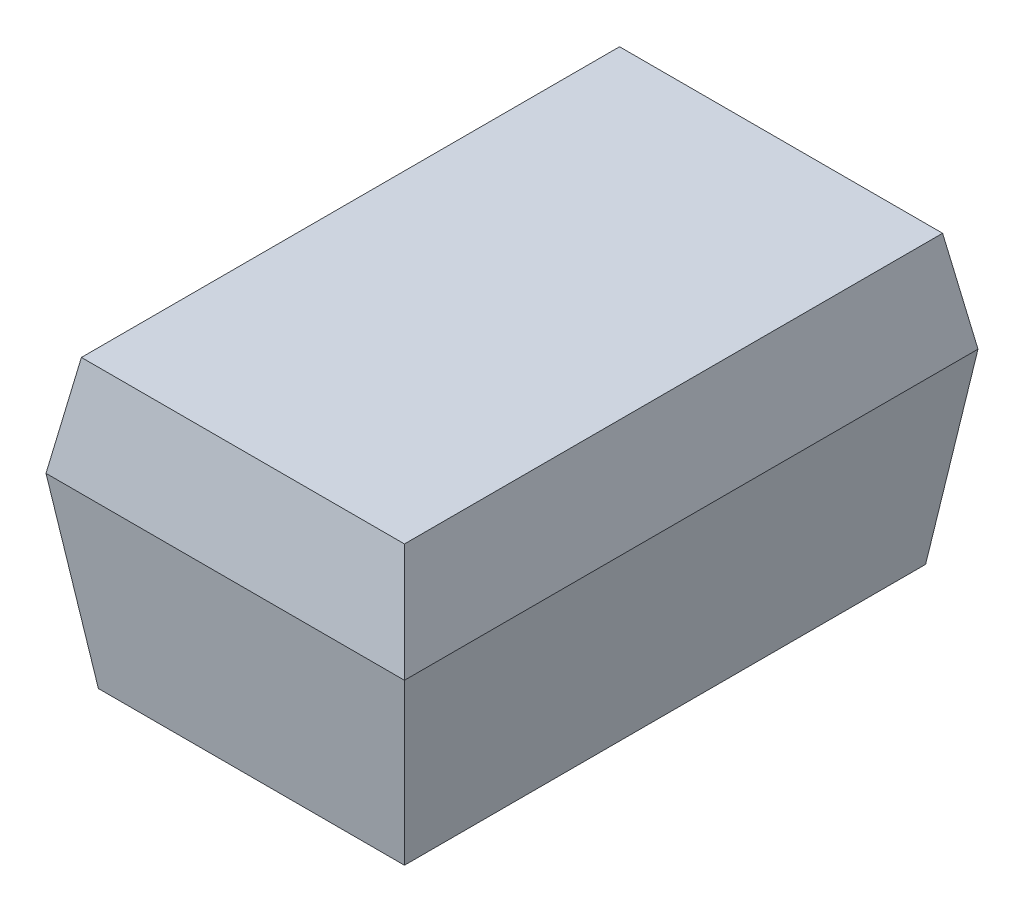
ISO-10303-21;
HEADER;
FILE_DESCRIPTION(('STEP AP214'),'2;1');
FILE_NAME('part.step','',(''),(''),'','','');
FILE_SCHEMA(('AUTOMOTIVE_DESIGN { 1 0 10303 214 1 1 1 1 }'));
ENDSEC;
DATA;
#1=APPLICATION_CONTEXT('core data for automotive mechanical design processes');
#2=APPLICATION_PROTOCOL_DEFINITION('international standard','automotive_design',2000,#1);
#3=PRODUCT_CONTEXT('',#1,'mechanical');
#4=PRODUCT('Part','Part','',(#3));
#5=PRODUCT_RELATED_PRODUCT_CATEGORY('part','',(#4));
#6=PRODUCT_DEFINITION_FORMATION('','',#4);
#7=PRODUCT_DEFINITION_CONTEXT('part definition',#1,'design');
#8=PRODUCT_DEFINITION('design','',#6,#7);
#9=PRODUCT_DEFINITION_SHAPE('','',#8);
#10=(LENGTH_UNIT() NAMED_UNIT(*) SI_UNIT(.MILLI.,.METRE.));
#11=(NAMED_UNIT(*) PLANE_ANGLE_UNIT() SI_UNIT($,.RADIAN.));
#12=(NAMED_UNIT(*) SI_UNIT($,.STERADIAN.) SOLID_ANGLE_UNIT());
#13=UNCERTAINTY_MEASURE_WITH_UNIT(LENGTH_MEASURE(1.E-05),#10,'distance_accuracy_value','');
#14=(GEOMETRIC_REPRESENTATION_CONTEXT(3) GLOBAL_UNCERTAINTY_ASSIGNED_CONTEXT((#13)) GLOBAL_UNIT_ASSIGNED_CONTEXT((#10,
#11,#12)) REPRESENTATION_CONTEXT('',''));
#15=CARTESIAN_POINT('',(0.,0.,0.));
#16=DIRECTION('',(0.,0.,1.));
#17=DIRECTION('',(1.,0.,0.));
#18=AXIS2_PLACEMENT_3D('',#15,#16,#17);
#19=CARTESIAN_POINT('',(-0.625,0.,1.));
#20=DIRECTION('',(-0.990268068741588,-0.139173100959942,0.));
#21=DIRECTION('',(0.139173100959942,-0.990268068741588,0.));
#22=AXIS2_PLACEMENT_3D('',#19,#20,#21);
#23=PLANE('',#22);
#24=DIRECTION('',(0.,0.,1.));
#25=VECTOR('',#24,1.);
#26=CARTESIAN_POINT('',(-0.625,0.,1.));
#27=LINE('',#26,#25);
#28=CARTESIAN_POINT('',(-0.625,0.,-1.));
#29=VERTEX_POINT('',#28);
#30=CARTESIAN_POINT('',(-0.625,0.,1.));
#31=VERTEX_POINT('',#30);
#32=EDGE_CURVE('E89',#29,#31,#27,.T.);
#33=ORIENTED_EDGE('',*,*,#32,.F.);
#34=DIRECTION('',(-0.137844537491984,0.980814848463889,-0.137844537491984));
#35=VECTOR('',#34,1.);
#36=CARTESIAN_POINT('',(-0.601248604355,-0.168999961439,-0.976248604355));
#37=LINE('',#36,#35);
#38=CARTESIAN_POINT('',(-0.533648457443,-0.65,-0.908648457443));
#39=VERTEX_POINT('',#38);
#40=EDGE_CURVE('E124',#39,#29,#37,.T.);
#41=ORIENTED_EDGE('',*,*,#40,.F.);
#42=DIRECTION('',(0.,0.,1.));
#43=VECTOR('',#42,1.);
#44=CARTESIAN_POINT('',(-0.533648457443,-0.65,0.));
#45=LINE('',#44,#43);
#46=CARTESIAN_POINT('',(-0.533648457443,-0.65,0.908648457443));
#47=VERTEX_POINT('',#46);
#48=EDGE_CURVE('E11',#39,#47,#45,.T.);
#49=ORIENTED_EDGE('',*,*,#48,.T.);
#50=DIRECTION('',(-0.137844537491984,0.980814848463889,0.137844537491984));
#51=VECTOR('',#50,1.);
#52=CARTESIAN_POINT('',(-0.625,0.,1.));
#53=LINE('',#52,#51);
#54=EDGE_CURVE('E27',#47,#31,#53,.T.);
#55=ORIENTED_EDGE('',*,*,#54,.T.);
#56=EDGE_LOOP('',(#33,#41,#49,#55));
#57=FACE_BOUND('',#56,.T.);
#58=ADVANCED_FACE('F17',(#57),#23,.T.);
#59=CARTESIAN_POINT('',(0.625,0.,-1.));
#60=DIRECTION('',(0.,-0.139173100959942,-0.990268068741588));
#61=DIRECTION('',(0.,0.990268068741588,-0.139173100959942));
#62=AXIS2_PLACEMENT_3D('',#59,#60,#61);
#63=PLANE('',#62);
#64=DIRECTION('',(-1.,0.,0.));
#65=VECTOR('',#64,1.);
#66=CARTESIAN_POINT('',(0.625,0.,-1.));
#67=LINE('',#66,#65);
#68=CARTESIAN_POINT('',(0.625,0.,-1.));
#69=VERTEX_POINT('',#68);
#70=EDGE_CURVE('E36',#69,#29,#67,.T.);
#71=ORIENTED_EDGE('',*,*,#70,.F.);
#72=DIRECTION('',(0.137844537491984,0.980814848463889,-0.137844537491984));
#73=VECTOR('',#72,1.);
#74=CARTESIAN_POINT('',(0.586997766967,-0.270399938303,-0.961997766967));
#75=LINE('',#74,#73);
#76=CARTESIAN_POINT('',(0.533648457443,-0.65,-0.908648457443));
#77=VERTEX_POINT('',#76);
#78=EDGE_CURVE('E118',#77,#69,#75,.T.);
#79=ORIENTED_EDGE('',*,*,#78,.F.);
#80=DIRECTION('',(-1.,0.,0.));
#81=VECTOR('',#80,1.);
#82=CARTESIAN_POINT('',(0.,-0.65,-0.908648457443));
#83=LINE('',#82,#81);
#84=EDGE_CURVE('E126',#77,#39,#83,.T.);
#85=ORIENTED_EDGE('',*,*,#84,.T.);
#86=ORIENTED_EDGE('',*,*,#40,.T.);
#87=EDGE_LOOP('',(#71,#79,#85,#86));
#88=FACE_BOUND('',#87,.T.);
#89=ADVANCED_FACE('F149',(#88),#63,.T.);
#90=CARTESIAN_POINT('',(0.625,0.,1.));
#91=DIRECTION('',(0.990268068741588,-0.139173100959942,0.));
#92=DIRECTION('',(0.139173100959942,0.990268068741588,0.));
#93=AXIS2_PLACEMENT_3D('',#90,#91,#92);
#94=PLANE('',#93);
#95=DIRECTION('',(0.,0.,-1.));
#96=VECTOR('',#95,1.);
#97=CARTESIAN_POINT('',(0.625,0.,1.));
#98=LINE('',#97,#96);
#99=CARTESIAN_POINT('',(0.625,0.,1.));
#100=VERTEX_POINT('',#99);
#101=EDGE_CURVE('E80',#100,#69,#98,.T.);
#102=ORIENTED_EDGE('',*,*,#101,.F.);
#103=DIRECTION('',(0.137844537491984,0.980814848463889,0.137844537491984));
#104=VECTOR('',#103,1.);
#105=CARTESIAN_POINT('',(0.625,0.,1.));
#106=LINE('',#105,#104);
#107=CARTESIAN_POINT('',(0.533648457443,-0.65,0.908648457443));
#108=VERTEX_POINT('',#107);
#109=EDGE_CURVE('E92',#108,#100,#106,.T.);
#110=ORIENTED_EDGE('',*,*,#109,.F.);
#111=DIRECTION('',(0.,0.,-1.));
#112=VECTOR('',#111,1.);
#113=CARTESIAN_POINT('',(0.533648457443,-0.65,0.));
#114=LINE('',#113,#112);
#115=EDGE_CURVE('E123',#108,#77,#114,.T.);
#116=ORIENTED_EDGE('',*,*,#115,.T.);
#117=ORIENTED_EDGE('',*,*,#78,.T.);
#118=EDGE_LOOP('',(#102,#110,#116,#117));
#119=FACE_BOUND('',#118,.T.);
#120=ADVANCED_FACE('F146',(#119),#94,.T.);
#121=CARTESIAN_POINT('',(0.625,0.,1.));
#122=DIRECTION('',(0.,-0.139173100959942,0.990268068741588));
#123=DIRECTION('',(0.,-0.990268068741588,-0.139173100959942));
#124=AXIS2_PLACEMENT_3D('',#121,#122,#123);
#125=PLANE('',#124);
#126=DIRECTION('',(1.,0.,0.));
#127=VECTOR('',#126,1.);
#128=CARTESIAN_POINT('',(0.625,0.,1.));
#129=LINE('',#128,#127);
#130=EDGE_CURVE('E90',#31,#100,#129,.T.);
#131=ORIENTED_EDGE('',*,*,#130,.F.);
#132=ORIENTED_EDGE('',*,*,#54,.F.);
#133=DIRECTION('',(1.,0.,0.));
#134=VECTOR('',#133,1.);
#135=CARTESIAN_POINT('',(0.,-0.65,0.908648457443));
#136=LINE('',#135,#134);
#137=EDGE_CURVE('E113',#47,#108,#136,.T.);
#138=ORIENTED_EDGE('',*,*,#137,.T.);
#139=ORIENTED_EDGE('',*,*,#109,.T.);
#140=EDGE_LOOP('',(#131,#132,#138,#139));
#141=FACE_BOUND('',#140,.T.);
#142=ADVANCED_FACE('F111',(#141),#125,.T.);
#143=CARTESIAN_POINT('',(0.,-0.65,0.));
#144=DIRECTION('',(0.,1.,0.));
#145=DIRECTION('',(0.,0.,1.));
#146=AXIS2_PLACEMENT_3D('',#143,#144,#145);
#147=PLANE('',#146);
#148=ORIENTED_EDGE('',*,*,#48,.F.);
#149=ORIENTED_EDGE('',*,*,#84,.F.);
#150=ORIENTED_EDGE('',*,*,#115,.F.);
#151=ORIENTED_EDGE('',*,*,#137,.F.);
#152=EDGE_LOOP('',(#148,#149,#150,#151));
#153=FACE_BOUND('',#152,.T.);
#154=ADVANCED_FACE('F137',(#153),#147,.F.);
#155=CARTESIAN_POINT('',(-0.625,0.,1.));
#156=DIRECTION('',(-0.98480775301219,0.173648177667033,0.));
#157=DIRECTION('',(-0.173648177667033,-0.98480775301219,0.));
#158=AXIS2_PLACEMENT_3D('',#155,#156,#157);
#159=PLANE('',#158);
#160=ORIENTED_EDGE('',*,*,#32,.T.);
#161=DIRECTION('',(-0.171087869745971,-0.970287525247837,0.171087869745971));
#162=VECTOR('',#161,1.);
#163=CARTESIAN_POINT('',(-0.588411176032,0.20750553217,0.963411176032));
#164=LINE('',#163,#162);
#165=CARTESIAN_POINT('',(-0.563285556752,0.35,0.938285556752));
#166=VERTEX_POINT('',#165);
#167=EDGE_CURVE('E95',#166,#31,#164,.T.);
#168=ORIENTED_EDGE('',*,*,#167,.F.);
#169=DIRECTION('',(0.,0.,1.));
#170=VECTOR('',#169,1.);
#171=CARTESIAN_POINT('',(-0.563285556752,0.35,1.));
#172=LINE('',#171,#170);
#173=CARTESIAN_POINT('',(-0.563285556752,0.35,-0.938285556752));
#174=VERTEX_POINT('',#173);
#175=EDGE_CURVE('E82',#174,#166,#172,.T.);
#176=ORIENTED_EDGE('',*,*,#175,.F.);
#177=DIRECTION('',(-0.171087869745971,-0.970287525247837,-0.171087869745971));
#178=VECTOR('',#177,1.);
#179=CARTESIAN_POINT('',(-0.566457881652,0.332008851472,-0.941457881652));
#180=LINE('',#179,#178);
#181=EDGE_CURVE('E86',#174,#29,#180,.T.);
#182=ORIENTED_EDGE('',*,*,#181,.T.);
#183=EDGE_LOOP('',(#160,#168,#176,#182));
#184=FACE_BOUND('',#183,.T.);
#185=ADVANCED_FACE('F104',(#184),#159,.T.);
#186=CARTESIAN_POINT('',(0.625,0.,1.));
#187=DIRECTION('',(0.,0.173648177667033,0.98480775301219));
#188=DIRECTION('',(0.,-0.98480775301219,0.173648177667033));
#189=AXIS2_PLACEMENT_3D('',#186,#187,#188);
#190=PLANE('',#189);
#191=ORIENTED_EDGE('',*,*,#130,.T.);
#192=DIRECTION('',(0.171087869745971,-0.970287525247837,0.171087869745971));
#193=VECTOR('',#192,1.);
#194=CARTESIAN_POINT('',(0.625,0.,1.));
#195=LINE('',#194,#193);
#196=CARTESIAN_POINT('',(0.563285556752,0.35,0.938285556752));
#197=VERTEX_POINT('',#196);
#198=EDGE_CURVE('E100',#197,#100,#195,.T.);
#199=ORIENTED_EDGE('',*,*,#198,.F.);
#200=DIRECTION('',(1.,0.,0.));
#201=VECTOR('',#200,1.);
#202=CARTESIAN_POINT('',(0.625,0.35,0.938285556752));
#203=LINE('',#202,#201);
#204=EDGE_CURVE('E68',#166,#197,#203,.T.);
#205=ORIENTED_EDGE('',*,*,#204,.F.);
#206=ORIENTED_EDGE('',*,*,#167,.T.);
#207=EDGE_LOOP('',(#191,#199,#205,#206));
#208=FACE_BOUND('',#207,.T.);
#209=ADVANCED_FACE('F107',(#208),#190,.T.);
#210=CARTESIAN_POINT('',(0.625,0.,1.));
#211=DIRECTION('',(0.98480775301219,0.173648177667033,0.));
#212=DIRECTION('',(-0.173648177667033,0.98480775301219,0.));
#213=AXIS2_PLACEMENT_3D('',#210,#211,#212);
#214=PLANE('',#213);
#215=ORIENTED_EDGE('',*,*,#101,.T.);
#216=DIRECTION('',(0.171087869745971,-0.970287525247837,-0.171087869745971));
#217=VECTOR('',#216,1.);
#218=CARTESIAN_POINT('',(0.625,0.,-1.));
#219=LINE('',#218,#217);
#220=CARTESIAN_POINT('',(0.563285556752,0.35,-0.938285556752));
#221=VERTEX_POINT('',#220);
#222=EDGE_CURVE('E78',#221,#69,#219,.T.);
#223=ORIENTED_EDGE('',*,*,#222,.F.);
#224=DIRECTION('',(0.,0.,-1.));
#225=VECTOR('',#224,1.);
#226=CARTESIAN_POINT('',(0.563285556752,0.35,1.));
#227=LINE('',#226,#225);
#228=EDGE_CURVE('E72',#197,#221,#227,.T.);
#229=ORIENTED_EDGE('',*,*,#228,.F.);
#230=ORIENTED_EDGE('',*,*,#198,.T.);
#231=EDGE_LOOP('',(#215,#223,#229,#230));
#232=FACE_BOUND('',#231,.T.);
#233=ADVANCED_FACE('F79',(#232),#214,.T.);
#234=CARTESIAN_POINT('',(0.625,0.,-1.));
#235=DIRECTION('',(0.,0.173648177667033,-0.98480775301219));
#236=DIRECTION('',(0.,0.98480775301219,0.173648177667033));
#237=AXIS2_PLACEMENT_3D('',#234,#235,#236);
#238=PLANE('',#237);
#239=ORIENTED_EDGE('',*,*,#70,.T.);
#240=ORIENTED_EDGE('',*,*,#181,.F.);
#241=DIRECTION('',(-1.,0.,0.));
#242=VECTOR('',#241,1.);
#243=CARTESIAN_POINT('',(0.625,0.35,-0.938285556752));
#244=LINE('',#243,#242);
#245=EDGE_CURVE('E21',#221,#174,#244,.T.);
#246=ORIENTED_EDGE('',*,*,#245,.F.);
#247=ORIENTED_EDGE('',*,*,#222,.T.);
#248=EDGE_LOOP('',(#239,#240,#246,#247));
#249=FACE_BOUND('',#248,.T.);
#250=ADVANCED_FACE('F84',(#249),#238,.T.);
#251=CARTESIAN_POINT('',(0.,0.35,0.));
#252=DIRECTION('',(0.,1.,0.));
#253=DIRECTION('',(0.,0.,1.));
#254=AXIS2_PLACEMENT_3D('',#251,#252,#253);
#255=PLANE('',#254);
#256=ORIENTED_EDGE('',*,*,#175,.T.);
#257=ORIENTED_EDGE('',*,*,#204,.T.);
#258=ORIENTED_EDGE('',*,*,#228,.T.);
#259=ORIENTED_EDGE('',*,*,#245,.T.);
#260=EDGE_LOOP('',(#256,#257,#258,#259));
#261=FACE_BOUND('',#260,.T.);
#262=ADVANCED_FACE('F19',(#261),#255,.T.);
#263=CLOSED_SHELL('',(#58,#89,#120,#142,#154,#185,#209,#233,#250,#262));
#264=MANIFOLD_SOLID_BREP('B1',#263);
#265=ADVANCED_BREP_SHAPE_REPRESENTATION('',(#18,#264),#14);
#266=SHAPE_DEFINITION_REPRESENTATION(#9,#265);
ENDSEC;
END-ISO-10303-21;
